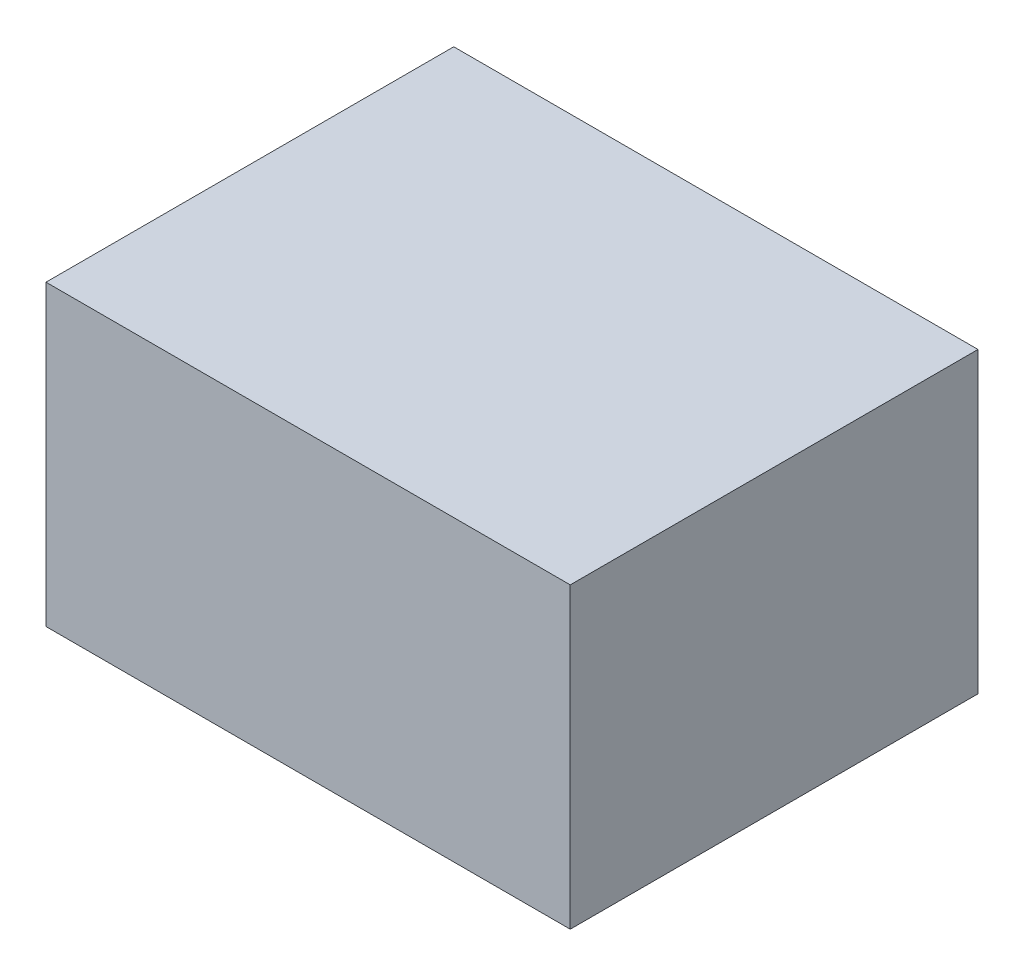
ISO-10303-21;
HEADER;
FILE_DESCRIPTION(('STEP AP214'),'2;1');
FILE_NAME('part.step','',(''),(''),'','','');
FILE_SCHEMA(('AUTOMOTIVE_DESIGN { 1 0 10303 214 1 1 1 1 }'));
ENDSEC;
DATA;
#1=APPLICATION_CONTEXT('core data for automotive mechanical design processes');
#2=APPLICATION_PROTOCOL_DEFINITION('international standard','automotive_design',2000,#1);
#3=PRODUCT_CONTEXT('',#1,'mechanical');
#4=PRODUCT('Part','Part','',(#3));
#5=PRODUCT_RELATED_PRODUCT_CATEGORY('part','',(#4));
#6=PRODUCT_DEFINITION_FORMATION('','',#4);
#7=PRODUCT_DEFINITION_CONTEXT('part definition',#1,'design');
#8=PRODUCT_DEFINITION('design','',#6,#7);
#9=PRODUCT_DEFINITION_SHAPE('','',#8);
#10=(LENGTH_UNIT() NAMED_UNIT(*) SI_UNIT(.MILLI.,.METRE.));
#11=(NAMED_UNIT(*) PLANE_ANGLE_UNIT() SI_UNIT($,.RADIAN.));
#12=(NAMED_UNIT(*) SI_UNIT($,.STERADIAN.) SOLID_ANGLE_UNIT());
#13=UNCERTAINTY_MEASURE_WITH_UNIT(LENGTH_MEASURE(1.E-05),#10,'distance_accuracy_value','');
#14=(GEOMETRIC_REPRESENTATION_CONTEXT(3) GLOBAL_UNCERTAINTY_ASSIGNED_CONTEXT((#13)) GLOBAL_UNIT_ASSIGNED_CONTEXT((#10,
#11,#12)) REPRESENTATION_CONTEXT('',''));
#15=CARTESIAN_POINT('',(0.,0.,0.));
#16=DIRECTION('',(0.,0.,1.));
#17=DIRECTION('',(1.,0.,0.));
#18=AXIS2_PLACEMENT_3D('',#15,#16,#17);
#19=CARTESIAN_POINT('',(-2.25,-1.21,3.5));
#20=DIRECTION('',(0.,1.,0.));
#21=DIRECTION('',(0.,0.,1.));
#22=AXIS2_PLACEMENT_3D('',#19,#20,#21);
#23=PLANE('',#22);
#24=DIRECTION('',(0.,0.,-1.));
#25=VECTOR('',#24,1.);
#26=CARTESIAN_POINT('',(-1.2,-1.21,3.5));
#27=LINE('',#26,#25);
#28=CARTESIAN_POINT('',(-1.2,-1.21,0.95));
#29=VERTEX_POINT('',#28);
#30=CARTESIAN_POINT('',(-1.2,-1.21,0.));
#31=VERTEX_POINT('',#30);
#32=EDGE_CURVE('E197',#29,#31,#27,.T.);
#33=ORIENTED_EDGE('',*,*,#32,.F.);
#34=DIRECTION('',(1.,0.,0.));
#35=VECTOR('',#34,1.);
#36=CARTESIAN_POINT('',(-2.25,-1.21,0.95));
#37=LINE('',#36,#35);
#38=CARTESIAN_POINT('',(-1.,-1.21,0.95));
#39=VERTEX_POINT('',#38);
#40=EDGE_CURVE('E194',#29,#39,#37,.T.);
#41=ORIENTED_EDGE('',*,*,#40,.T.);
#42=DIRECTION('',(0.,0.,-1.));
#43=VECTOR('',#42,1.);
#44=CARTESIAN_POINT('',(-1.,-1.21,2.55));
#45=LINE('',#44,#43);
#46=CARTESIAN_POINT('',(-1.,-1.21,2.55));
#47=VERTEX_POINT('',#46);
#48=EDGE_CURVE('E213',#47,#39,#45,.T.);
#49=ORIENTED_EDGE('',*,*,#48,.F.);
#50=DIRECTION('',(-1.,0.,0.));
#51=VECTOR('',#50,1.);
#52=CARTESIAN_POINT('',(1.,-1.21,2.55));
#53=LINE('',#52,#51);
#54=CARTESIAN_POINT('',(1.,-1.21,2.55));
#55=VERTEX_POINT('',#54);
#56=EDGE_CURVE('E210',#55,#47,#53,.T.);
#57=ORIENTED_EDGE('',*,*,#56,.F.);
#58=DIRECTION('',(0.,0.,-1.));
#59=VECTOR('',#58,1.);
#60=CARTESIAN_POINT('',(1.,-1.21,2.55));
#61=LINE('',#60,#59);
#62=CARTESIAN_POINT('',(1.,-1.21,0.95));
#63=VERTEX_POINT('',#62);
#64=EDGE_CURVE('E217',#55,#63,#61,.T.);
#65=ORIENTED_EDGE('',*,*,#64,.T.);
#66=CARTESIAN_POINT('',(1.2,-1.21,0.95));
#67=VERTEX_POINT('',#66);
#68=EDGE_CURVE('E61',#63,#67,#37,.T.);
#69=ORIENTED_EDGE('',*,*,#68,.T.);
#70=DIRECTION('',(0.,0.,1.));
#71=VECTOR('',#70,1.);
#72=CARTESIAN_POINT('',(1.2,-1.21,3.5));
#73=LINE('',#72,#71);
#74=CARTESIAN_POINT('',(1.2,-1.21,0.));
#75=VERTEX_POINT('',#74);
#76=EDGE_CURVE('E149',#75,#67,#73,.T.);
#77=ORIENTED_EDGE('',*,*,#76,.F.);
#78=DIRECTION('',(1.,0.,0.));
#79=VECTOR('',#78,1.);
#80=CARTESIAN_POINT('',(-2.25,-1.21,0.));
#81=LINE('',#80,#79);
#82=CARTESIAN_POINT('',(2.25,-1.21,0.));
#83=VERTEX_POINT('',#82);
#84=EDGE_CURVE('E243',#75,#83,#81,.T.);
#85=ORIENTED_EDGE('',*,*,#84,.T.);
#86=DIRECTION('',(0.,0.,-1.));
#87=VECTOR('',#86,1.);
#88=CARTESIAN_POINT('',(2.25,-1.21,3.5));
#89=LINE('',#88,#87);
#90=CARTESIAN_POINT('',(2.25,-1.21,3.5));
#91=VERTEX_POINT('',#90);
#92=EDGE_CURVE('E257',#91,#83,#89,.T.);
#93=ORIENTED_EDGE('',*,*,#92,.F.);
#94=DIRECTION('',(1.,0.,0.));
#95=VECTOR('',#94,1.);
#96=CARTESIAN_POINT('',(-2.25,-1.21,3.5));
#97=LINE('',#96,#95);
#98=CARTESIAN_POINT('',(-2.25,-1.21,3.5));
#99=VERTEX_POINT('',#98);
#100=EDGE_CURVE('E98',#99,#91,#97,.T.);
#101=ORIENTED_EDGE('',*,*,#100,.F.);
#102=DIRECTION('',(0.,0.,-1.));
#103=VECTOR('',#102,1.);
#104=CARTESIAN_POINT('',(-2.25,-1.21,3.5));
#105=LINE('',#104,#103);
#106=CARTESIAN_POINT('',(-2.25,-1.21,0.));
#107=VERTEX_POINT('',#106);
#108=EDGE_CURVE('E54',#99,#107,#105,.T.);
#109=ORIENTED_EDGE('',*,*,#108,.T.);
#110=EDGE_CURVE('E244',#107,#31,#81,.T.);
#111=ORIENTED_EDGE('',*,*,#110,.T.);
#112=EDGE_LOOP('',(#33,#41,#49,#57,#65,#69,#77,#85,#93,#101,#109,#111));
#113=FACE_BOUND('',#112,.T.);
#114=ADVANCED_FACE('F45',(#113),#23,.F.);
#115=CARTESIAN_POINT('',(0.,0.,0.));
#116=DIRECTION('',(0.,0.,1.));
#117=DIRECTION('',(1.,0.,0.));
#118=AXIS2_PLACEMENT_3D('',#115,#116,#117);
#119=PLANE('',#118);
#120=DIRECTION('',(0.,-1.,0.));
#121=VECTOR('',#120,1.);
#122=CARTESIAN_POINT('',(-1.2,-1.1,0.));
#123=LINE('',#122,#121);
#124=CARTESIAN_POINT('',(-1.2,-1.1,0.));
#125=VERTEX_POINT('',#124);
#126=EDGE_CURVE('E176',#125,#31,#123,.T.);
#127=ORIENTED_EDGE('',*,*,#126,.T.);
#128=ORIENTED_EDGE('',*,*,#110,.F.);
#129=DIRECTION('',(0.,-1.,0.));
#130=VECTOR('',#129,1.);
#131=CARTESIAN_POINT('',(-2.25,1.35,0.));
#132=LINE('',#131,#130);
#133=CARTESIAN_POINT('',(-2.25,1.35,0.));
#134=VERTEX_POINT('',#133);
#135=EDGE_CURVE('E228',#134,#107,#132,.T.);
#136=ORIENTED_EDGE('',*,*,#135,.F.);
#137=DIRECTION('',(-1.,0.,0.));
#138=VECTOR('',#137,1.);
#139=CARTESIAN_POINT('',(2.25,1.35,0.));
#140=LINE('',#139,#138);
#141=CARTESIAN_POINT('',(2.25,1.35,0.));
#142=VERTEX_POINT('',#141);
#143=EDGE_CURVE('E90',#142,#134,#140,.T.);
#144=ORIENTED_EDGE('',*,*,#143,.F.);
#145=DIRECTION('',(0.,1.,0.));
#146=VECTOR('',#145,1.);
#147=CARTESIAN_POINT('',(2.25,-1.21,0.));
#148=LINE('',#147,#146);
#149=EDGE_CURVE('E248',#83,#142,#148,.T.);
#150=ORIENTED_EDGE('',*,*,#149,.F.);
#151=ORIENTED_EDGE('',*,*,#84,.F.);
#152=DIRECTION('',(0.,1.,0.));
#153=VECTOR('',#152,1.);
#154=CARTESIAN_POINT('',(1.2,-2.2,0.));
#155=LINE('',#154,#153);
#156=CARTESIAN_POINT('',(1.2,-1.1,0.));
#157=VERTEX_POINT('',#156);
#158=EDGE_CURVE('E180',#75,#157,#155,.T.);
#159=ORIENTED_EDGE('',*,*,#158,.T.);
#160=DIRECTION('',(-1.,0.,0.));
#161=VECTOR('',#160,1.);
#162=CARTESIAN_POINT('',(1.2,-1.1,0.));
#163=LINE('',#162,#161);
#164=EDGE_CURVE('E159',#157,#125,#163,.T.);
#165=ORIENTED_EDGE('',*,*,#164,.T.);
#166=EDGE_LOOP('',(#127,#128,#136,#144,#150,#151,#159,#165));
#167=FACE_BOUND('',#166,.T.);
#168=ADVANCED_FACE('F268',(#167),#119,.F.);
#169=CARTESIAN_POINT('',(-2.25,1.35,3.5));
#170=DIRECTION('',(1.,0.,0.));
#171=DIRECTION('',(0.,0.,-1.));
#172=AXIS2_PLACEMENT_3D('',#169,#170,#171);
#173=PLANE('',#172);
#174=ORIENTED_EDGE('',*,*,#135,.T.);
#175=ORIENTED_EDGE('',*,*,#108,.F.);
#176=DIRECTION('',(0.,-1.,0.));
#177=VECTOR('',#176,1.);
#178=CARTESIAN_POINT('',(-2.25,1.35,3.5));
#179=LINE('',#178,#177);
#180=CARTESIAN_POINT('',(-2.25,1.35,3.5));
#181=VERTEX_POINT('',#180);
#182=EDGE_CURVE('E229',#181,#99,#179,.T.);
#183=ORIENTED_EDGE('',*,*,#182,.F.);
#184=DIRECTION('',(0.,0.,-1.));
#185=VECTOR('',#184,1.);
#186=CARTESIAN_POINT('',(-2.25,1.35,3.5));
#187=LINE('',#186,#185);
#188=EDGE_CURVE('E239',#181,#134,#187,.T.);
#189=ORIENTED_EDGE('',*,*,#188,.T.);
#190=EDGE_LOOP('',(#174,#175,#183,#189));
#191=FACE_BOUND('',#190,.T.);
#192=ADVANCED_FACE('F47',(#191),#173,.F.);
#193=CARTESIAN_POINT('',(2.25,-1.21,3.5));
#194=DIRECTION('',(-1.,0.,0.));
#195=DIRECTION('',(0.,0.,1.));
#196=AXIS2_PLACEMENT_3D('',#193,#194,#195);
#197=PLANE('',#196);
#198=ORIENTED_EDGE('',*,*,#149,.T.);
#199=DIRECTION('',(0.,0.,-1.));
#200=VECTOR('',#199,1.);
#201=CARTESIAN_POINT('',(2.25,1.35,3.5));
#202=LINE('',#201,#200);
#203=CARTESIAN_POINT('',(2.25,1.35,3.5));
#204=VERTEX_POINT('',#203);
#205=EDGE_CURVE('E254',#204,#142,#202,.T.);
#206=ORIENTED_EDGE('',*,*,#205,.F.);
#207=DIRECTION('',(0.,1.,0.));
#208=VECTOR('',#207,1.);
#209=CARTESIAN_POINT('',(2.25,-1.21,3.5));
#210=LINE('',#209,#208);
#211=EDGE_CURVE('E234',#91,#204,#210,.T.);
#212=ORIENTED_EDGE('',*,*,#211,.F.);
#213=ORIENTED_EDGE('',*,*,#92,.T.);
#214=EDGE_LOOP('',(#198,#206,#212,#213));
#215=FACE_BOUND('',#214,.T.);
#216=ADVANCED_FACE('F305',(#215),#197,.F.);
#217=CARTESIAN_POINT('',(2.25,1.35,3.5));
#218=DIRECTION('',(0.,-1.,0.));
#219=DIRECTION('',(0.,0.,-1.));
#220=AXIS2_PLACEMENT_3D('',#217,#218,#219);
#221=PLANE('',#220);
#222=ORIENTED_EDGE('',*,*,#143,.T.);
#223=ORIENTED_EDGE('',*,*,#188,.F.);
#224=DIRECTION('',(-1.,0.,0.));
#225=VECTOR('',#224,1.);
#226=CARTESIAN_POINT('',(2.25,1.35,3.5));
#227=LINE('',#226,#225);
#228=EDGE_CURVE('E69',#204,#181,#227,.T.);
#229=ORIENTED_EDGE('',*,*,#228,.F.);
#230=ORIENTED_EDGE('',*,*,#205,.T.);
#231=EDGE_LOOP('',(#222,#223,#229,#230));
#232=FACE_BOUND('',#231,.T.);
#233=ADVANCED_FACE('F308',(#232),#221,.F.);
#234=CARTESIAN_POINT('',(0.,0.,3.5));
#235=DIRECTION('',(0.,0.,1.));
#236=DIRECTION('',(1.,0.,0.));
#237=AXIS2_PLACEMENT_3D('',#234,#235,#236);
#238=PLANE('',#237);
#239=ORIENTED_EDGE('',*,*,#182,.T.);
#240=ORIENTED_EDGE('',*,*,#100,.T.);
#241=ORIENTED_EDGE('',*,*,#211,.T.);
#242=ORIENTED_EDGE('',*,*,#228,.T.);
#243=EDGE_LOOP('',(#239,#240,#241,#242));
#244=FACE_BOUND('',#243,.T.);
#245=ADVANCED_FACE('F297',(#244),#238,.T.);
#246=CARTESIAN_POINT('',(-1.,-1.21,2.55));
#247=DIRECTION('',(1.,0.,0.));
#248=DIRECTION('',(0.,0.,-1.));
#249=AXIS2_PLACEMENT_3D('',#246,#247,#248);
#250=PLANE('',#249);
#251=ORIENTED_EDGE('',*,*,#48,.T.);
#252=DIRECTION('',(0.,-1.,0.));
#253=VECTOR('',#252,1.);
#254=CARTESIAN_POINT('',(-1.,-1.21,0.95));
#255=LINE('',#254,#253);
#256=CARTESIAN_POINT('',(-1.,-2.04,0.95));
#257=VERTEX_POINT('',#256);
#258=EDGE_CURVE('E188',#39,#257,#255,.T.);
#259=ORIENTED_EDGE('',*,*,#258,.T.);
#260=DIRECTION('',(0.,0.,-1.));
#261=VECTOR('',#260,1.);
#262=CARTESIAN_POINT('',(-1.,-2.04,2.55));
#263=LINE('',#262,#261);
#264=CARTESIAN_POINT('',(-1.,-2.04,2.55));
#265=VERTEX_POINT('',#264);
#266=EDGE_CURVE('E224',#265,#257,#263,.T.);
#267=ORIENTED_EDGE('',*,*,#266,.F.);
#268=DIRECTION('',(0.,-1.,0.));
#269=VECTOR('',#268,1.);
#270=CARTESIAN_POINT('',(-1.,-1.21,2.55));
#271=LINE('',#270,#269);
#272=EDGE_CURVE('E200',#47,#265,#271,.T.);
#273=ORIENTED_EDGE('',*,*,#272,.F.);
#274=EDGE_LOOP('',(#251,#259,#267,#273));
#275=FACE_BOUND('',#274,.T.);
#276=ADVANCED_FACE('F279',(#275),#250,.F.);
#277=CARTESIAN_POINT('',(-1.,-2.04,2.55));
#278=DIRECTION('',(0.,1.,0.));
#279=DIRECTION('',(0.,0.,1.));
#280=AXIS2_PLACEMENT_3D('',#277,#278,#279);
#281=PLANE('',#280);
#282=ORIENTED_EDGE('',*,*,#266,.T.);
#283=DIRECTION('',(1.,0.,0.));
#284=VECTOR('',#283,1.);
#285=CARTESIAN_POINT('',(-1.,-2.04,0.95));
#286=LINE('',#285,#284);
#287=CARTESIAN_POINT('',(1.,-2.04,0.95));
#288=VERTEX_POINT('',#287);
#289=EDGE_CURVE('E162',#257,#288,#286,.T.);
#290=ORIENTED_EDGE('',*,*,#289,.T.);
#291=DIRECTION('',(0.,0.,-1.));
#292=VECTOR('',#291,1.);
#293=CARTESIAN_POINT('',(1.,-2.04,2.55));
#294=LINE('',#293,#292);
#295=CARTESIAN_POINT('',(1.,-2.04,2.55));
#296=VERTEX_POINT('',#295);
#297=EDGE_CURVE('E221',#296,#288,#294,.T.);
#298=ORIENTED_EDGE('',*,*,#297,.F.);
#299=DIRECTION('',(1.,0.,0.));
#300=VECTOR('',#299,1.);
#301=CARTESIAN_POINT('',(-1.,-2.04,2.55));
#302=LINE('',#301,#300);
#303=EDGE_CURVE('E204',#265,#296,#302,.T.);
#304=ORIENTED_EDGE('',*,*,#303,.F.);
#305=EDGE_LOOP('',(#282,#290,#298,#304));
#306=FACE_BOUND('',#305,.T.);
#307=ADVANCED_FACE('F289',(#306),#281,.F.);
#308=CARTESIAN_POINT('',(1.,-2.04,2.55));
#309=DIRECTION('',(-1.,0.,0.));
#310=DIRECTION('',(0.,0.,1.));
#311=AXIS2_PLACEMENT_3D('',#308,#309,#310);
#312=PLANE('',#311);
#313=ORIENTED_EDGE('',*,*,#297,.T.);
#314=DIRECTION('',(0.,1.,0.));
#315=VECTOR('',#314,1.);
#316=CARTESIAN_POINT('',(1.,-2.04,0.95));
#317=LINE('',#316,#315);
#318=EDGE_CURVE('E11',#288,#63,#317,.T.);
#319=ORIENTED_EDGE('',*,*,#318,.T.);
#320=ORIENTED_EDGE('',*,*,#64,.F.);
#321=DIRECTION('',(0.,1.,0.));
#322=VECTOR('',#321,1.);
#323=CARTESIAN_POINT('',(1.,-2.04,2.55));
#324=LINE('',#323,#322);
#325=EDGE_CURVE('E207',#296,#55,#324,.T.);
#326=ORIENTED_EDGE('',*,*,#325,.F.);
#327=EDGE_LOOP('',(#313,#319,#320,#326));
#328=FACE_BOUND('',#327,.T.);
#329=ADVANCED_FACE('F287',(#328),#312,.F.);
#330=CARTESIAN_POINT('',(0.,0.,2.55));
#331=DIRECTION('',(0.,0.,1.));
#332=DIRECTION('',(1.,0.,0.));
#333=AXIS2_PLACEMENT_3D('',#330,#331,#332);
#334=PLANE('',#333);
#335=ORIENTED_EDGE('',*,*,#272,.T.);
#336=ORIENTED_EDGE('',*,*,#303,.T.);
#337=ORIENTED_EDGE('',*,*,#325,.T.);
#338=ORIENTED_EDGE('',*,*,#56,.T.);
#339=EDGE_LOOP('',(#335,#336,#337,#338));
#340=FACE_BOUND('',#339,.T.);
#341=ADVANCED_FACE('F282',(#340),#334,.T.);
#342=CARTESIAN_POINT('',(-1.2,-1.1,0.95));
#343=DIRECTION('',(1.,0.,0.));
#344=DIRECTION('',(0.,0.,-1.));
#345=AXIS2_PLACEMENT_3D('',#342,#343,#344);
#346=PLANE('',#345);
#347=ORIENTED_EDGE('',*,*,#32,.T.);
#348=ORIENTED_EDGE('',*,*,#126,.F.);
#349=DIRECTION('',(0.,0.,-1.));
#350=VECTOR('',#349,1.);
#351=CARTESIAN_POINT('',(-1.2,-1.1,0.95));
#352=LINE('',#351,#350);
#353=CARTESIAN_POINT('',(-1.2,-1.1,0.95));
#354=VERTEX_POINT('',#353);
#355=EDGE_CURVE('E163',#354,#125,#352,.T.);
#356=ORIENTED_EDGE('',*,*,#355,.F.);
#357=DIRECTION('',(0.,-1.,0.));
#358=VECTOR('',#357,1.);
#359=CARTESIAN_POINT('',(-1.2,-1.1,0.95));
#360=LINE('',#359,#358);
#361=EDGE_CURVE('E153',#354,#29,#360,.T.);
#362=ORIENTED_EDGE('',*,*,#361,.T.);
#363=EDGE_LOOP('',(#347,#348,#356,#362));
#364=FACE_BOUND('',#363,.T.);
#365=ADVANCED_FACE('F272',(#364),#346,.T.);
#366=CARTESIAN_POINT('',(1.2,-2.2,0.95));
#367=DIRECTION('',(-1.,0.,0.));
#368=DIRECTION('',(0.,0.,1.));
#369=AXIS2_PLACEMENT_3D('',#366,#367,#368);
#370=PLANE('',#369);
#371=ORIENTED_EDGE('',*,*,#76,.T.);
#372=DIRECTION('',(0.,1.,0.));
#373=VECTOR('',#372,1.);
#374=CARTESIAN_POINT('',(1.2,-2.2,0.95));
#375=LINE('',#374,#373);
#376=CARTESIAN_POINT('',(1.2,-1.1,0.95));
#377=VERTEX_POINT('',#376);
#378=EDGE_CURVE('E143',#67,#377,#375,.T.);
#379=ORIENTED_EDGE('',*,*,#378,.T.);
#380=DIRECTION('',(0.,0.,-1.));
#381=VECTOR('',#380,1.);
#382=CARTESIAN_POINT('',(1.2,-1.1,0.95));
#383=LINE('',#382,#381);
#384=EDGE_CURVE('E146',#377,#157,#383,.T.);
#385=ORIENTED_EDGE('',*,*,#384,.T.);
#386=ORIENTED_EDGE('',*,*,#158,.F.);
#387=EDGE_LOOP('',(#371,#379,#385,#386));
#388=FACE_BOUND('',#387,.T.);
#389=ADVANCED_FACE('F145',(#388),#370,.T.);
#390=CARTESIAN_POINT('',(0.,0.,0.95));
#391=DIRECTION('',(0.,0.,1.));
#392=DIRECTION('',(1.,0.,0.));
#393=AXIS2_PLACEMENT_3D('',#390,#391,#392);
#394=PLANE('',#393);
#395=ORIENTED_EDGE('',*,*,#361,.F.);
#396=DIRECTION('',(-1.,0.,0.));
#397=VECTOR('',#396,1.);
#398=CARTESIAN_POINT('',(1.2,-1.1,0.95));
#399=LINE('',#398,#397);
#400=EDGE_CURVE('E152',#377,#354,#399,.T.);
#401=ORIENTED_EDGE('',*,*,#400,.F.);
#402=ORIENTED_EDGE('',*,*,#378,.F.);
#403=ORIENTED_EDGE('',*,*,#68,.F.);
#404=ORIENTED_EDGE('',*,*,#318,.F.);
#405=ORIENTED_EDGE('',*,*,#289,.F.);
#406=ORIENTED_EDGE('',*,*,#258,.F.);
#407=ORIENTED_EDGE('',*,*,#40,.F.);
#408=EDGE_LOOP('',(#395,#401,#402,#403,#404,#405,#406,#407));
#409=FACE_BOUND('',#408,.T.);
#410=ADVANCED_FACE('F166',(#409),#394,.F.);
#411=CARTESIAN_POINT('',(1.2,-1.1,0.95));
#412=DIRECTION('',(0.,-1.,0.));
#413=DIRECTION('',(0.,0.,-1.));
#414=AXIS2_PLACEMENT_3D('',#411,#412,#413);
#415=PLANE('',#414);
#416=ORIENTED_EDGE('',*,*,#164,.F.);
#417=ORIENTED_EDGE('',*,*,#384,.F.);
#418=ORIENTED_EDGE('',*,*,#400,.T.);
#419=ORIENTED_EDGE('',*,*,#355,.T.);
#420=EDGE_LOOP('',(#416,#417,#418,#419));
#421=FACE_BOUND('',#420,.T.);
#422=ADVANCED_FACE('F156',(#421),#415,.T.);
#423=CLOSED_SHELL('',(#114,#168,#192,#216,#233,#245,#276,#307,#329,#341,#365,#389,#410,#422));
#424=MANIFOLD_SOLID_BREP('B2',#423);
#425=ADVANCED_BREP_SHAPE_REPRESENTATION('',(#18,#424),#14);
#426=SHAPE_DEFINITION_REPRESENTATION(#9,#425);
ENDSEC;
END-ISO-10303-21;
